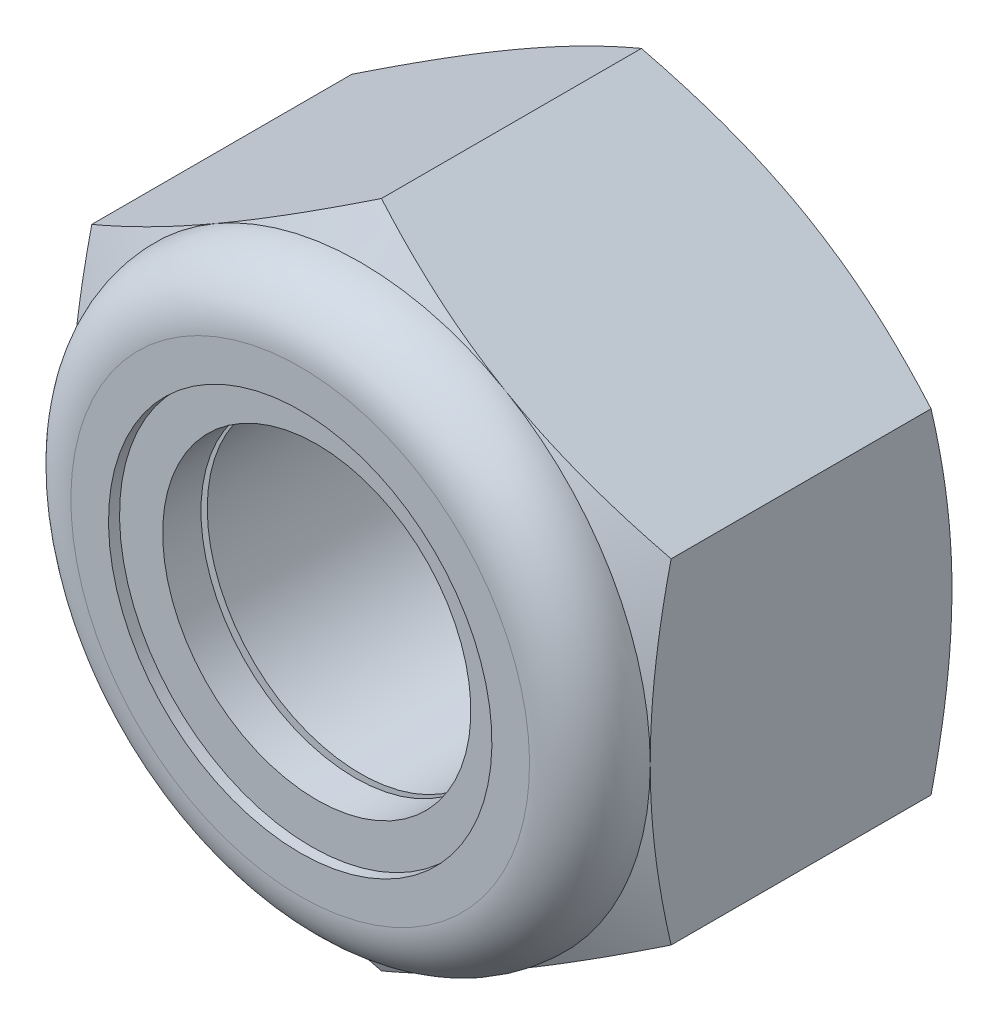
ISO-10303-21;
HEADER;
FILE_DESCRIPTION(('STEP AP214'),'2;1');
FILE_NAME('part.step','',(''),(''),'','','');
FILE_SCHEMA(('AUTOMOTIVE_DESIGN { 1 0 10303 214 1 1 1 1 }'));
ENDSEC;
DATA;
#1=APPLICATION_CONTEXT('core data for automotive mechanical design processes');
#2=APPLICATION_PROTOCOL_DEFINITION('international standard','automotive_design',2000,#1);
#3=PRODUCT_CONTEXT('',#1,'mechanical');
#4=PRODUCT('Part','Part','',(#3));
#5=PRODUCT_RELATED_PRODUCT_CATEGORY('part','',(#4));
#6=PRODUCT_DEFINITION_FORMATION('','',#4);
#7=PRODUCT_DEFINITION_CONTEXT('part definition',#1,'design');
#8=PRODUCT_DEFINITION('design','',#6,#7);
#9=PRODUCT_DEFINITION_SHAPE('','',#8);
#10=(LENGTH_UNIT() NAMED_UNIT(*) SI_UNIT(.MILLI.,.METRE.));
#11=(NAMED_UNIT(*) PLANE_ANGLE_UNIT() SI_UNIT($,.RADIAN.));
#12=(NAMED_UNIT(*) SI_UNIT($,.STERADIAN.) SOLID_ANGLE_UNIT());
#13=UNCERTAINTY_MEASURE_WITH_UNIT(LENGTH_MEASURE(1.E-05),#10,'distance_accuracy_value','');
#14=(GEOMETRIC_REPRESENTATION_CONTEXT(3) GLOBAL_UNCERTAINTY_ASSIGNED_CONTEXT((#13)) GLOBAL_UNIT_ASSIGNED_CONTEXT((#10,
#11,#12)) REPRESENTATION_CONTEXT('',''));
#15=CARTESIAN_POINT('',(0.,0.,0.));
#16=DIRECTION('',(0.,0.,1.));
#17=DIRECTION('',(1.,0.,0.));
#18=AXIS2_PLACEMENT_3D('',#15,#16,#17);
#19=CARTESIAN_POINT('',(0.,3.16666666666667,4.8476));
#20=DIRECTION('',(0.,0.,1.));
#21=DIRECTION('',(0.,-1.,0.));
#22=AXIS2_PLACEMENT_3D('',#19,#20,#21);
#23=PLANE('',#22);
#24=CARTESIAN_POINT('',(0.,0.,4.8476));
#25=DIRECTION('',(0.,0.,-1.));
#26=DIRECTION('',(0.,1.,0.));
#27=AXIS2_PLACEMENT_3D('',#24,#25,#26);
#28=CIRCLE('',#27,2.64719450303479);
#29=CARTESIAN_POINT('',(0.,-2.64719450303479,4.8476));
#30=VERTEX_POINT('',#29);
#31=EDGE_CURVE('P0_E404',#30,#30,#28,.T.);
#32=ORIENTED_EDGE('',*,*,#31,.F.);
#33=EDGE_LOOP('',(#32));
#34=FACE_BOUND('',#33,.T.);
#35=CARTESIAN_POINT('',(0.,0.,4.8476));
#36=DIRECTION('',(0.,0.,-1.));
#37=DIRECTION('',(0.,1.,0.));
#38=AXIS2_PLACEMENT_3D('',#35,#36,#37);
#39=CIRCLE('',#38,3.16666666666667);
#40=CARTESIAN_POINT('',(0.,-3.16666666666667,4.8476));
#41=VERTEX_POINT('',#40);
#42=EDGE_CURVE('P0_E451',#41,#41,#39,.T.);
#43=ORIENTED_EDGE('',*,*,#42,.T.);
#44=EDGE_LOOP('',(#43));
#45=FACE_BOUND('',#44,.T.);
#46=ADVANCED_FACE('P0_F17',(#34,#45),#23,.F.);
#47=CARTESIAN_POINT('',(0.,0.,4.16666666666667));
#48=DIRECTION('',(0.,0.,-1.));
#49=DIRECTION('',(-1.,0.,0.));
#50=AXIS2_PLACEMENT_3D('',#47,#48,#49);
#51=PLANE('',#50);
#52=CARTESIAN_POINT('',(0.,0.,4.16666666666667));
#53=DIRECTION('',(0.,0.,-1.));
#54=DIRECTION('',(-1.,0.,0.));
#55=AXIS2_PLACEMENT_3D('',#52,#53,#54);
#56=CIRCLE('',#55,2.117);
#57=CARTESIAN_POINT('',(2.117,0.,4.16666666666667));
#58=VERTEX_POINT('',#57);
#59=EDGE_CURVE('P0_E258',#58,#58,#56,.T.);
#60=ORIENTED_EDGE('',*,*,#59,.T.);
#61=EDGE_LOOP('',(#60));
#62=FACE_BOUND('',#61,.T.);
#63=CARTESIAN_POINT('',(0.,0.,4.16666666666667));
#64=DIRECTION('',(0.,0.,-1.));
#65=DIRECTION('',(0.,1.,0.));
#66=AXIS2_PLACEMENT_3D('',#63,#64,#65);
#67=CIRCLE('',#66,3.8476);
#68=CARTESIAN_POINT('',(0.,-3.8476,4.16666666666667));
#69=VERTEX_POINT('',#68);
#70=EDGE_CURVE('P0_E288',#69,#69,#67,.T.);
#71=ORIENTED_EDGE('',*,*,#70,.F.);
#72=EDGE_LOOP('',(#71));
#73=FACE_BOUND('',#72,.T.);
#74=ADVANCED_FACE('P0_F709',(#62,#73),#51,.F.);
#75=CARTESIAN_POINT('',(4.,2.3094010767585,5.));
#76=DIRECTION('',(-0.5,-0.866025403784439,0.));
#77=DIRECTION('',(-0.866025403784439,0.5,0.));
#78=AXIS2_PLACEMENT_3D('',#75,#76,#77);
#79=PLANE('',#78);
#80=DIRECTION('',(0.,0.,-1.));
#81=VECTOR('',#80,1.);
#82=CARTESIAN_POINT('',(0.,4.61880215351701,5.));
#83=LINE('',#82,#81);
#84=CARTESIAN_POINT('',(0.,4.61880215351701,3.87811448359888));
#85=VERTEX_POINT('',#84);
#86=CARTESIAN_POINT('',(0.,4.61880215351701,0.288552183067788));
#87=VERTEX_POINT('',#86);
#88=EDGE_CURVE('P0_E11',#85,#87,#83,.T.);
#89=ORIENTED_EDGE('',*,*,#88,.F.);
#90=CARTESIAN_POINT('',(-8.6979939773308E-12,4.61880215352203,3.87811448359654));
#91=CARTESIAN_POINT('',(1.071796769721,4.00000000000202,4.16666666666667));
#92=CARTESIAN_POINT('',(2.00000000000001,3.46410161513776,4.16666666666667));
#93=(BOUNDED_CURVE() B_SPLINE_CURVE(2,(#90,#91,#92),.UNSPECIFIED.,.F.,
.F.) B_SPLINE_CURVE_WITH_KNOTS((3,3),(1.00048260004605,1.54304701650115),
.UNSPECIFIED.) CURVE() GEOMETRIC_REPRESENTATION_ITEM() RATIONAL_B_SPLINE_CURVE((2.21375918402254,
2.38499405282908,2.38499405282908)) REPRESENTATION_ITEM(''));
#94=CARTESIAN_POINT('',(2.,3.46410161513776,4.16666666666667));
#95=VERTEX_POINT('',#94);
#96=EDGE_CURVE('P0_E289',#85,#95,#93,.T.);
#97=ORIENTED_EDGE('',*,*,#96,.T.);
#98=CARTESIAN_POINT('',(2.00000000000001,3.46410161513776,4.16666666666667));
#99=CARTESIAN_POINT('',(2.92820323027901,2.92820323027349,4.16666666666667));
#100=CARTESIAN_POINT('',(4.0000000000087,2.30940107675349,3.87811448359654));
#101=(BOUNDED_CURVE() B_SPLINE_CURVE(2,(#98,#99,#100),.UNSPECIFIED.,.F.,
.F.) B_SPLINE_CURVE_WITH_KNOTS((3,3),(1.54304701650115,2.08561143295624),
.UNSPECIFIED.) CURVE() GEOMETRIC_REPRESENTATION_ITEM() RATIONAL_B_SPLINE_CURVE((2.38499405282908,
2.38499405282908,2.21375918402255)) REPRESENTATION_ITEM(''));
#102=CARTESIAN_POINT('',(4.,2.30940107675851,3.87811448359888));
#103=VERTEX_POINT('',#102);
#104=EDGE_CURVE('P0_E348',#95,#103,#101,.T.);
#105=ORIENTED_EDGE('',*,*,#104,.T.);
#106=DIRECTION('',(0.,0.,-1.));
#107=VECTOR('',#106,1.);
#108=CARTESIAN_POINT('',(4.,2.3094010767585,5.));
#109=LINE('',#108,#107);
#110=CARTESIAN_POINT('',(4.,2.30940107675851,0.288552183067787));
#111=VERTEX_POINT('',#110);
#112=EDGE_CURVE('P0_E171',#103,#111,#109,.T.);
#113=ORIENTED_EDGE('',*,*,#112,.T.);
#114=CARTESIAN_POINT('',(4.0000000000087,2.30940107675349,0.288552183070129));
#115=CARTESIAN_POINT('',(2.928203230279,2.9282032302735,0.));
#116=CARTESIAN_POINT('',(2.,3.46410161513776,0.));
#117=(BOUNDED_CURVE() B_SPLINE_CURVE(2,(#114,#115,#116),.UNSPECIFIED.,.F.,
.F.) B_SPLINE_CURVE_WITH_KNOTS((3,3),(1.00048260004605,1.54304701650115),
.UNSPECIFIED.) CURVE() GEOMETRIC_REPRESENTATION_ITEM() RATIONAL_B_SPLINE_CURVE((2.21375918402254,
2.38499405282908,2.38499405282908)) REPRESENTATION_ITEM(''));
#118=CARTESIAN_POINT('',(2.,3.46410161513776,0.));
#119=VERTEX_POINT('',#118);
#120=EDGE_CURVE('P0_E331',#111,#119,#117,.T.);
#121=ORIENTED_EDGE('',*,*,#120,.T.);
#122=CARTESIAN_POINT('',(2.,3.46410161513776,0.));
#123=CARTESIAN_POINT('',(1.07179676972099,4.00000000000203,0.));
#124=CARTESIAN_POINT('',(-8.70240726793949E-12,4.61880215352204,0.288552183070132));
#125=(BOUNDED_CURVE() B_SPLINE_CURVE(2,(#122,#123,#124),.UNSPECIFIED.,.F.,
.F.) B_SPLINE_CURVE_WITH_KNOTS((3,3),(1.54304701650115,2.08561143295625),
.UNSPECIFIED.) CURVE() GEOMETRIC_REPRESENTATION_ITEM() RATIONAL_B_SPLINE_CURVE((2.38499405282908,
2.38499405282908,2.21375918402254)) REPRESENTATION_ITEM(''));
#126=EDGE_CURVE('P0_E309',#119,#87,#125,.T.);
#127=ORIENTED_EDGE('',*,*,#126,.T.);
#128=EDGE_LOOP('',(#89,#97,#105,#113,#121,#127));
#129=FACE_BOUND('',#128,.T.);
#130=ADVANCED_FACE('P0_F549',(#129),#79,.F.);
#131=CARTESIAN_POINT('',(0.,4.61880215351701,5.));
#132=DIRECTION('',(0.5,-0.866025403784439,0.));
#133=DIRECTION('',(0.,0.,-1.));
#134=AXIS2_PLACEMENT_3D('',#131,#132,#133);
#135=PLANE('',#134);
#136=DIRECTION('',(0.,0.,-1.));
#137=VECTOR('',#136,1.);
#138=CARTESIAN_POINT('',(-4.,2.3094010767585,5.));
#139=LINE('',#138,#137);
#140=CARTESIAN_POINT('',(-4.,2.3094010767585,3.87811448359888));
#141=VERTEX_POINT('',#140);
#142=CARTESIAN_POINT('',(-4.,2.30940107675851,0.288552183067787));
#143=VERTEX_POINT('',#142);
#144=EDGE_CURVE('P0_E28',#141,#143,#139,.T.);
#145=ORIENTED_EDGE('',*,*,#144,.F.);
#146=CARTESIAN_POINT('',(-4.0000000000087,2.30940107675348,3.87811448359654));
#147=CARTESIAN_POINT('',(-2.928203230279,2.92820323027349,4.16666666666667));
#148=CARTESIAN_POINT('',(-1.99999999999999,3.46410161513776,4.16666666666667));
#149=(BOUNDED_CURVE() B_SPLINE_CURVE(2,(#146,#147,#148),.UNSPECIFIED.,.F.,
.F.) B_SPLINE_CURVE_WITH_KNOTS((3,3),(1.00048260004605,1.54304701650115),
.UNSPECIFIED.) CURVE() GEOMETRIC_REPRESENTATION_ITEM() RATIONAL_B_SPLINE_CURVE((2.21375918402254,
2.38499405282908,2.38499405282908)) REPRESENTATION_ITEM(''));
#150=CARTESIAN_POINT('',(-2.,3.46410161513776,4.16666666666667));
#151=VERTEX_POINT('',#150);
#152=EDGE_CURVE('P0_E230',#141,#151,#149,.T.);
#153=ORIENTED_EDGE('',*,*,#152,.T.);
#154=CARTESIAN_POINT('',(-1.99999999999999,3.46410161513776,4.16666666666667));
#155=CARTESIAN_POINT('',(-1.07179676972099,4.00000000000202,4.16666666666667));
#156=CARTESIAN_POINT('',(8.69358068672214E-12,4.61880215352203,3.87811448359654));
#157=(BOUNDED_CURVE() B_SPLINE_CURVE(2,(#154,#155,#156),.UNSPECIFIED.,.F.,
.F.) B_SPLINE_CURVE_WITH_KNOTS((3,3),(1.54304701650115,2.08561143295625),
.UNSPECIFIED.) CURVE() GEOMETRIC_REPRESENTATION_ITEM() RATIONAL_B_SPLINE_CURVE((2.38499405282908,
2.38499405282908,2.21375918402255)) REPRESENTATION_ITEM(''));
#158=EDGE_CURVE('P0_E295',#151,#85,#157,.T.);
#159=ORIENTED_EDGE('',*,*,#158,.T.);
#160=ORIENTED_EDGE('',*,*,#88,.T.);
#161=CARTESIAN_POINT('',(8.70020062263516E-12,4.61880215352203,0.288552183070129));
#162=CARTESIAN_POINT('',(-1.071796769721,4.00000000000202,0.));
#163=CARTESIAN_POINT('',(-2.00000000000001,3.46410161513775,0.));
#164=(BOUNDED_CURVE() B_SPLINE_CURVE(2,(#161,#162,#163),.UNSPECIFIED.,.F.,
.F.) B_SPLINE_CURVE_WITH_KNOTS((3,3),(1.00048260004605,1.54304701650115),
.UNSPECIFIED.) CURVE() GEOMETRIC_REPRESENTATION_ITEM() RATIONAL_B_SPLINE_CURVE((2.21375918402254,
2.38499405282908,2.38499405282908)) REPRESENTATION_ITEM(''));
#165=CARTESIAN_POINT('',(-2.,3.46410161513776,0.));
#166=VERTEX_POINT('',#165);
#167=EDGE_CURVE('P0_E315',#87,#166,#164,.T.);
#168=ORIENTED_EDGE('',*,*,#167,.T.);
#169=CARTESIAN_POINT('',(-2.00000000000001,3.46410161513775,0.));
#170=CARTESIAN_POINT('',(-2.92820323027901,2.92820323027349,0.));
#171=CARTESIAN_POINT('',(-4.0000000000087,2.30940107675348,0.288552183070129));
#172=(BOUNDED_CURVE() B_SPLINE_CURVE(2,(#169,#170,#171),.UNSPECIFIED.,.F.,
.F.) B_SPLINE_CURVE_WITH_KNOTS((3,3),(1.54304701650115,2.08561143295625),
.UNSPECIFIED.) CURVE() GEOMETRIC_REPRESENTATION_ITEM() RATIONAL_B_SPLINE_CURVE((2.38499405282908,
2.38499405282908,2.21375918402254)) REPRESENTATION_ITEM(''));
#173=EDGE_CURVE('P0_E212',#166,#143,#172,.T.);
#174=ORIENTED_EDGE('',*,*,#173,.T.);
#175=EDGE_LOOP('',(#145,#153,#159,#160,#168,#174));
#176=FACE_BOUND('',#175,.T.);
#177=ADVANCED_FACE('P0_F546',(#176),#135,.F.);
#178=CARTESIAN_POINT('',(-4.,2.3094010767585,5.));
#179=DIRECTION('',(1.,0.,0.));
#180=DIRECTION('',(0.,1.,0.));
#181=AXIS2_PLACEMENT_3D('',#178,#179,#180);
#182=PLANE('',#181);
#183=DIRECTION('',(0.,0.,-1.));
#184=VECTOR('',#183,1.);
#185=CARTESIAN_POINT('',(-4.,-2.3094010767585,5.));
#186=LINE('',#185,#184);
#187=CARTESIAN_POINT('',(-4.,-2.3094010767585,3.87811448359888));
#188=VERTEX_POINT('',#187);
#189=CARTESIAN_POINT('',(-4.,-2.3094010767585,0.288552183067786));
#190=VERTEX_POINT('',#189);
#191=EDGE_CURVE('P0_E137',#188,#190,#186,.T.);
#192=ORIENTED_EDGE('',*,*,#191,.F.);
#193=CARTESIAN_POINT('',(-4.,-2.30940107676855,3.87811448359654));
#194=CARTESIAN_POINT('',(-4.,-1.07179676972853,4.16666666666667));
#195=CARTESIAN_POINT('',(-4.,0.,4.16666666666667));
#196=(BOUNDED_CURVE() B_SPLINE_CURVE(2,(#193,#194,#195),.UNSPECIFIED.,.F.,
.F.) B_SPLINE_CURVE_WITH_KNOTS((3,3),(1.00048260004605,1.54304701650115),
.UNSPECIFIED.) CURVE() GEOMETRIC_REPRESENTATION_ITEM() RATIONAL_B_SPLINE_CURVE((2.21375918402254,
2.38499405282908,2.38499405282908)) REPRESENTATION_ITEM(''));
#197=CARTESIAN_POINT('',(-4.,0.,4.16666666666667));
#198=VERTEX_POINT('',#197);
#199=EDGE_CURVE('P0_E235',#188,#198,#196,.T.);
#200=ORIENTED_EDGE('',*,*,#199,.T.);
#201=CARTESIAN_POINT('',(-4.,0.,4.16666666666667));
#202=CARTESIAN_POINT('',(-4.,1.07179676972853,4.16666666666667));
#203=CARTESIAN_POINT('',(-4.,2.30940107676855,3.87811448359654));
#204=(BOUNDED_CURVE() B_SPLINE_CURVE(2,(#201,#202,#203),.UNSPECIFIED.,.F.,
.F.) B_SPLINE_CURVE_WITH_KNOTS((3,3),(1.54304701650115,2.08561143295625),
.UNSPECIFIED.) CURVE() GEOMETRIC_REPRESENTATION_ITEM() RATIONAL_B_SPLINE_CURVE((2.38499405282908,
2.38499405282908,2.21375918402254)) REPRESENTATION_ITEM(''));
#205=EDGE_CURVE('P0_E182',#198,#141,#204,.T.);
#206=ORIENTED_EDGE('',*,*,#205,.T.);
#207=ORIENTED_EDGE('',*,*,#144,.T.);
#208=CARTESIAN_POINT('',(-4.,2.30940107676855,0.28855218307013));
#209=CARTESIAN_POINT('',(-4.,1.07179676972853,0.));
#210=CARTESIAN_POINT('',(-4.,0.,0.));
#211=(BOUNDED_CURVE() B_SPLINE_CURVE(2,(#208,#209,#210),.UNSPECIFIED.,.F.,
.F.) B_SPLINE_CURVE_WITH_KNOTS((3,3),(1.00048260004605,1.54304701650115),
.UNSPECIFIED.) CURVE() GEOMETRIC_REPRESENTATION_ITEM() RATIONAL_B_SPLINE_CURVE((2.21375918402254,
2.38499405282908,2.38499405282908)) REPRESENTATION_ITEM(''));
#212=CARTESIAN_POINT('',(-4.,0.,0.));
#213=VERTEX_POINT('',#212);
#214=EDGE_CURVE('P0_E220',#143,#213,#211,.T.);
#215=ORIENTED_EDGE('',*,*,#214,.T.);
#216=CARTESIAN_POINT('',(-4.,0.,0.));
#217=CARTESIAN_POINT('',(-4.,-1.07179676972853,0.));
#218=CARTESIAN_POINT('',(-4.,-2.30940107676854,0.288552183070126));
#219=(BOUNDED_CURVE() B_SPLINE_CURVE(2,(#216,#217,#218),.UNSPECIFIED.,.F.,
.F.) B_SPLINE_CURVE_WITH_KNOTS((3,3),(1.54304701650115,2.08561143295624),
.UNSPECIFIED.) CURVE() GEOMETRIC_REPRESENTATION_ITEM() RATIONAL_B_SPLINE_CURVE((2.38499405282908,
2.38499405282908,2.21375918402254)) REPRESENTATION_ITEM(''));
#220=EDGE_CURVE('P0_E271',#213,#190,#219,.T.);
#221=ORIENTED_EDGE('',*,*,#220,.T.);
#222=EDGE_LOOP('',(#192,#200,#206,#207,#215,#221));
#223=FACE_BOUND('',#222,.T.);
#224=ADVANCED_FACE('P0_F542',(#223),#182,.F.);
#225=CARTESIAN_POINT('',(-4.,-2.3094010767585,5.));
#226=DIRECTION('',(0.5,0.866025403784439,0.));
#227=DIRECTION('',(0.,0.,-1.));
#228=AXIS2_PLACEMENT_3D('',#225,#226,#227);
#229=PLANE('',#228);
#230=DIRECTION('',(0.,0.,-1.));
#231=VECTOR('',#230,1.);
#232=CARTESIAN_POINT('',(0.,-4.61880215351701,5.));
#233=LINE('',#232,#231);
#234=CARTESIAN_POINT('',(0.,-4.61880215351701,3.87811448359888));
#235=VERTEX_POINT('',#234);
#236=CARTESIAN_POINT('',(0.,-4.61880215351701,0.288552183067786));
#237=VERTEX_POINT('',#236);
#238=EDGE_CURVE('P0_E241',#235,#237,#233,.T.);
#239=ORIENTED_EDGE('',*,*,#238,.F.);
#240=CARTESIAN_POINT('',(8.70020062263514E-12,-4.61880215352203,3.87811448359654));
#241=CARTESIAN_POINT('',(-1.07179676972099,-4.00000000000202,4.16666666666666));
#242=CARTESIAN_POINT('',(-1.99999999999999,-3.46410161513776,4.16666666666667));
#243=(BOUNDED_CURVE() B_SPLINE_CURVE(2,(#240,#241,#242),.UNSPECIFIED.,.F.,
.F.) B_SPLINE_CURVE_WITH_KNOTS((3,3),(1.00048260004605,1.54304701650115),
.UNSPECIFIED.) CURVE() GEOMETRIC_REPRESENTATION_ITEM() RATIONAL_B_SPLINE_CURVE((2.21375918402255,
2.38499405282909,2.38499405282909)) REPRESENTATION_ITEM(''));
#244=CARTESIAN_POINT('',(-2.,-3.46410161513776,4.16666666666667));
#245=VERTEX_POINT('',#244);
#246=EDGE_CURVE('P0_E180',#235,#245,#243,.T.);
#247=ORIENTED_EDGE('',*,*,#246,.T.);
#248=CARTESIAN_POINT('',(-1.99999999999999,-3.46410161513776,4.16666666666667));
#249=CARTESIAN_POINT('',(-2.928203230279,-2.92820323027349,4.16666666666667));
#250=CARTESIAN_POINT('',(-4.00000000000871,-2.30940107675348,3.87811448359654));
#251=(BOUNDED_CURVE() B_SPLINE_CURVE(2,(#248,#249,#250),.UNSPECIFIED.,.F.,
.F.) B_SPLINE_CURVE_WITH_KNOTS((3,3),(1.54304701650115,2.08561143295625),
.UNSPECIFIED.) CURVE() GEOMETRIC_REPRESENTATION_ITEM() RATIONAL_B_SPLINE_CURVE((2.38499405282909,
2.38499405282909,2.21375918402255)) REPRESENTATION_ITEM(''));
#252=EDGE_CURVE('P0_E278',#245,#188,#251,.T.);
#253=ORIENTED_EDGE('',*,*,#252,.T.);
#254=ORIENTED_EDGE('',*,*,#191,.T.);
#255=CARTESIAN_POINT('',(-4.0000000000087,-2.30940107675348,0.288552183070128));
#256=CARTESIAN_POINT('',(-2.92820323027901,-2.92820323027349,0.));
#257=CARTESIAN_POINT('',(-2.,-3.46410161513775,0.));
#258=(BOUNDED_CURVE() B_SPLINE_CURVE(2,(#255,#256,#257),.UNSPECIFIED.,.F.,
.F.) B_SPLINE_CURVE_WITH_KNOTS((3,3),(1.00048260004605,1.54304701650115),
.UNSPECIFIED.) CURVE() GEOMETRIC_REPRESENTATION_ITEM() RATIONAL_B_SPLINE_CURVE((2.21375918402255,
2.38499405282909,2.38499405282909)) REPRESENTATION_ITEM(''));
#259=CARTESIAN_POINT('',(-2.,-3.46410161513776,0.));
#260=VERTEX_POINT('',#259);
#261=EDGE_CURVE('P0_E78',#190,#260,#258,.T.);
#262=ORIENTED_EDGE('',*,*,#261,.T.);
#263=CARTESIAN_POINT('',(-2.,-3.46410161513775,0.));
#264=CARTESIAN_POINT('',(-1.071796769721,-4.00000000000202,0.));
#265=CARTESIAN_POINT('',(8.69478431143359E-12,-4.61880215352203,0.288552183070127));
#266=(BOUNDED_CURVE() B_SPLINE_CURVE(2,(#263,#264,#265),.UNSPECIFIED.,.F.,
.F.) B_SPLINE_CURVE_WITH_KNOTS((3,3),(1.54304701650115,2.08561143295625),
.UNSPECIFIED.) CURVE() GEOMETRIC_REPRESENTATION_ITEM() RATIONAL_B_SPLINE_CURVE((2.38499405282909,
2.38499405282909,2.21375918402255)) REPRESENTATION_ITEM(''));
#267=EDGE_CURVE('P0_E393',#260,#237,#266,.T.);
#268=ORIENTED_EDGE('',*,*,#267,.T.);
#269=EDGE_LOOP('',(#239,#247,#253,#254,#262,#268));
#270=FACE_BOUND('',#269,.T.);
#271=ADVANCED_FACE('P0_F731',(#270),#229,.F.);
#272=CARTESIAN_POINT('',(0.,-4.61880215351701,5.));
#273=DIRECTION('',(-0.5,0.866025403784439,0.));
#274=DIRECTION('',(0.,0.,1.));
#275=AXIS2_PLACEMENT_3D('',#272,#273,#274);
#276=PLANE('',#275);
#277=DIRECTION('',(0.,0.,-1.));
#278=VECTOR('',#277,1.);
#279=CARTESIAN_POINT('',(4.,-2.30940107675851,5.));
#280=LINE('',#279,#278);
#281=CARTESIAN_POINT('',(4.,-2.30940107675851,3.87811448359888));
#282=VERTEX_POINT('',#281);
#283=CARTESIAN_POINT('',(4.,-2.30940107675851,0.288552183067786));
#284=VERTEX_POINT('',#283);
#285=EDGE_CURVE('P0_E42',#282,#284,#280,.T.);
#286=ORIENTED_EDGE('',*,*,#285,.F.);
#287=CARTESIAN_POINT('',(4.0000000000087,-2.30940107675348,3.87811448359654));
#288=CARTESIAN_POINT('',(2.928203230279,-2.92820323027349,4.16666666666667));
#289=CARTESIAN_POINT('',(1.99999999999999,-3.46410161513776,4.16666666666667));
#290=(BOUNDED_CURVE() B_SPLINE_CURVE(2,(#287,#288,#289),.UNSPECIFIED.,.F.,
.F.) B_SPLINE_CURVE_WITH_KNOTS((3,3),(1.00048260004605,1.54304701650115),
.UNSPECIFIED.) CURVE() GEOMETRIC_REPRESENTATION_ITEM() RATIONAL_B_SPLINE_CURVE((2.21375918402254,
2.38499405282908,2.38499405282908)) REPRESENTATION_ITEM(''));
#291=CARTESIAN_POINT('',(2.,-3.46410161513776,4.16666666666667));
#292=VERTEX_POINT('',#291);
#293=EDGE_CURVE('P0_E166',#282,#292,#290,.T.);
#294=ORIENTED_EDGE('',*,*,#293,.T.);
#295=CARTESIAN_POINT('',(1.99999999999999,-3.46410161513776,4.16666666666667));
#296=CARTESIAN_POINT('',(1.07179676972099,-4.00000000000202,4.16666666666666));
#297=CARTESIAN_POINT('',(-8.70200605970234E-12,-4.61880215352203,3.87811448359654));
#298=(BOUNDED_CURVE() B_SPLINE_CURVE(2,(#295,#296,#297),.UNSPECIFIED.,.F.,
.F.) B_SPLINE_CURVE_WITH_KNOTS((3,3),(1.54304701650115,2.08561143295625),
.UNSPECIFIED.) CURVE() GEOMETRIC_REPRESENTATION_ITEM() RATIONAL_B_SPLINE_CURVE((2.38499405282908,
2.38499405282908,2.21375918402254)) REPRESENTATION_ITEM(''));
#299=EDGE_CURVE('P0_E169',#292,#235,#298,.T.);
#300=ORIENTED_EDGE('',*,*,#299,.T.);
#301=ORIENTED_EDGE('',*,*,#238,.T.);
#302=CARTESIAN_POINT('',(-8.70822478737819E-12,-4.61880215352203,0.288552183070128));
#303=CARTESIAN_POINT('',(1.07179676972099,-4.00000000000202,0.));
#304=CARTESIAN_POINT('',(2.,-3.46410161513776,0.));
#305=(BOUNDED_CURVE() B_SPLINE_CURVE(2,(#302,#303,#304),.UNSPECIFIED.,.F.,
.F.) B_SPLINE_CURVE_WITH_KNOTS((3,3),(1.00048260004605,1.54304701650115),
.UNSPECIFIED.) CURVE() GEOMETRIC_REPRESENTATION_ITEM() RATIONAL_B_SPLINE_CURVE((2.21375918402254,
2.38499405282908,2.38499405282909)) REPRESENTATION_ITEM(''));
#306=CARTESIAN_POINT('',(2.,-3.46410161513776,0.));
#307=VERTEX_POINT('',#306);
#308=EDGE_CURVE('P0_E385',#237,#307,#305,.T.);
#309=ORIENTED_EDGE('',*,*,#308,.T.);
#310=CARTESIAN_POINT('',(2.,-3.46410161513776,0.));
#311=CARTESIAN_POINT('',(2.928203230279,-2.92820323027349,0.));
#312=CARTESIAN_POINT('',(4.0000000000087,-2.30940107675348,0.288552183070127));
#313=(BOUNDED_CURVE() B_SPLINE_CURVE(2,(#310,#311,#312),.UNSPECIFIED.,.F.,
.F.) B_SPLINE_CURVE_WITH_KNOTS((3,3),(1.54304701650115,2.08561143295625),
.UNSPECIFIED.) CURVE() GEOMETRIC_REPRESENTATION_ITEM() RATIONAL_B_SPLINE_CURVE((2.38499405282908,
2.38499405282908,2.21375918402254)) REPRESENTATION_ITEM(''));
#314=EDGE_CURVE('P0_E92',#307,#284,#313,.T.);
#315=ORIENTED_EDGE('',*,*,#314,.T.);
#316=EDGE_LOOP('',(#286,#294,#300,#301,#309,#315));
#317=FACE_BOUND('',#316,.T.);
#318=ADVANCED_FACE('P0_F168',(#317),#276,.F.);
#319=CARTESIAN_POINT('',(4.,-2.30940107675851,5.));
#320=DIRECTION('',(-1.,0.,0.));
#321=DIRECTION('',(0.,1.,0.));
#322=AXIS2_PLACEMENT_3D('',#319,#320,#321);
#323=PLANE('',#322);
#324=ORIENTED_EDGE('',*,*,#112,.F.);
#325=CARTESIAN_POINT('',(4.,2.30940107676855,3.87811448359654));
#326=CARTESIAN_POINT('',(4.,1.07179676972852,4.16666666666667));
#327=CARTESIAN_POINT('',(4.,0.,4.16666666666667));
#328=(BOUNDED_CURVE() B_SPLINE_CURVE(2,(#325,#326,#327),.UNSPECIFIED.,.F.,
.F.) B_SPLINE_CURVE_WITH_KNOTS((3,3),(1.00048260004605,1.54304701650115),
.UNSPECIFIED.) CURVE() GEOMETRIC_REPRESENTATION_ITEM() RATIONAL_B_SPLINE_CURVE((2.21375918402254,
2.38499405282908,2.38499405282908)) REPRESENTATION_ITEM(''));
#329=CARTESIAN_POINT('',(4.,0.,4.16666666666667));
#330=VERTEX_POINT('',#329);
#331=EDGE_CURVE('P0_E211',#103,#330,#328,.T.);
#332=ORIENTED_EDGE('',*,*,#331,.T.);
#333=CARTESIAN_POINT('',(4.,0.,4.16666666666667));
#334=CARTESIAN_POINT('',(4.,-1.07179676972854,4.16666666666666));
#335=CARTESIAN_POINT('',(4.,-2.30940107676855,3.87811448359654));
#336=(BOUNDED_CURVE() B_SPLINE_CURVE(2,(#333,#334,#335),.UNSPECIFIED.,.F.,
.F.) B_SPLINE_CURVE_WITH_KNOTS((3,3),(1.54304701650115,2.08561143295625),
.UNSPECIFIED.) CURVE() GEOMETRIC_REPRESENTATION_ITEM() RATIONAL_B_SPLINE_CURVE((2.38499405282908,
2.38499405282908,2.21375918402254)) REPRESENTATION_ITEM(''));
#337=EDGE_CURVE('P0_E161',#330,#282,#336,.T.);
#338=ORIENTED_EDGE('',*,*,#337,.T.);
#339=ORIENTED_EDGE('',*,*,#285,.T.);
#340=CARTESIAN_POINT('',(4.,-2.30940107676855,0.288552183070128));
#341=CARTESIAN_POINT('',(4.,-1.07179676972853,0.));
#342=CARTESIAN_POINT('',(4.,0.,0.));
#343=(BOUNDED_CURVE() B_SPLINE_CURVE(2,(#340,#341,#342),.UNSPECIFIED.,.F.,
.F.) B_SPLINE_CURVE_WITH_KNOTS((3,3),(1.00048260004605,1.54304701650115),
.UNSPECIFIED.) CURVE() GEOMETRIC_REPRESENTATION_ITEM() RATIONAL_B_SPLINE_CURVE((2.21375918402254,
2.38499405282908,2.38499405282908)) REPRESENTATION_ITEM(''));
#344=CARTESIAN_POINT('',(4.,0.,0.));
#345=VERTEX_POINT('',#344);
#346=EDGE_CURVE('P0_E263',#284,#345,#343,.T.);
#347=ORIENTED_EDGE('',*,*,#346,.T.);
#348=CARTESIAN_POINT('',(4.,0.,0.));
#349=CARTESIAN_POINT('',(4.,1.07179676972853,0.));
#350=CARTESIAN_POINT('',(4.,2.30940107676855,0.288552183070129));
#351=(BOUNDED_CURVE() B_SPLINE_CURVE(2,(#348,#349,#350),.UNSPECIFIED.,.F.,
.F.) B_SPLINE_CURVE_WITH_KNOTS((3,3),(1.54304701650115,2.08561143295625),
.UNSPECIFIED.) CURVE() GEOMETRIC_REPRESENTATION_ITEM() RATIONAL_B_SPLINE_CURVE((2.38499405282908,
2.38499405282908,2.21375918402254)) REPRESENTATION_ITEM(''));
#352=EDGE_CURVE('P0_E270',#345,#111,#351,.T.);
#353=ORIENTED_EDGE('',*,*,#352,.T.);
#354=EDGE_LOOP('',(#324,#332,#338,#339,#347,#353));
#355=FACE_BOUND('',#354,.T.);
#356=ADVANCED_FACE('P0_F467',(#355),#323,.F.);
#357=CARTESIAN_POINT('',(0.,0.,4.16666666666667));
#358=DIRECTION('',(0.,0.,-1.));
#359=DIRECTION('',(0.,1.,0.));
#360=AXIS2_PLACEMENT_3D('',#357,#358,#359);
#361=CONICAL_SURFACE('',#360,4.,1.13446401379631);
#362=ORIENTED_EDGE('',*,*,#337,.F.);
#363=CARTESIAN_POINT('',(0.,0.,4.16666666666667));
#364=DIRECTION('',(0.,0.,-1.));
#365=DIRECTION('',(0.,1.,0.));
#366=AXIS2_PLACEMENT_3D('',#363,#364,#365);
#367=CIRCLE('',#366,4.);
#368=EDGE_CURVE('P0_E184',#330,#292,#367,.T.);
#369=ORIENTED_EDGE('',*,*,#368,.T.);
#370=ORIENTED_EDGE('',*,*,#293,.F.);
#371=EDGE_LOOP('',(#362,#369,#370));
#372=FACE_BOUND('',#371,.T.);
#373=ADVANCED_FACE('P0_F185',(#372),#361,.T.);
#374=CARTESIAN_POINT('',(0.,0.,4.16666666666667));
#375=DIRECTION('',(0.,0.,-1.));
#376=DIRECTION('',(0.,1.,0.));
#377=AXIS2_PLACEMENT_3D('',#374,#375,#376);
#378=CONICAL_SURFACE('',#377,4.,1.13446401379631);
#379=CARTESIAN_POINT('',(0.,0.,4.16666666666667));
#380=DIRECTION('',(0.,0.,-1.));
#381=DIRECTION('',(0.,1.,0.));
#382=AXIS2_PLACEMENT_3D('',#379,#380,#381);
#383=CIRCLE('',#382,4.);
#384=EDGE_CURVE('P0_E189',#95,#330,#383,.T.);
#385=ORIENTED_EDGE('',*,*,#384,.T.);
#386=ORIENTED_EDGE('',*,*,#331,.F.);
#387=ORIENTED_EDGE('',*,*,#104,.F.);
#388=EDGE_LOOP('',(#385,#386,#387));
#389=FACE_BOUND('',#388,.T.);
#390=ADVANCED_FACE('P0_F19',(#389),#378,.T.);
#391=CARTESIAN_POINT('',(0.,0.,4.16666666666667));
#392=DIRECTION('',(0.,0.,-1.));
#393=DIRECTION('',(0.,-1.,0.));
#394=AXIS2_PLACEMENT_3D('',#391,#392,#393);
#395=CONICAL_SURFACE('',#394,4.,1.13446401379631);
#396=ORIENTED_EDGE('',*,*,#299,.F.);
#397=CARTESIAN_POINT('',(0.,0.,4.16666666666667));
#398=DIRECTION('',(0.,0.,-1.));
#399=DIRECTION('',(0.,1.,0.));
#400=AXIS2_PLACEMENT_3D('',#397,#398,#399);
#401=CIRCLE('',#400,4.);
#402=CARTESIAN_POINT('',(0.,-4.,4.16666666666667));
#403=VERTEX_POINT('',#402);
#404=EDGE_CURVE('P0_E178',#292,#403,#401,.T.);
#405=ORIENTED_EDGE('',*,*,#404,.T.);
#406=CARTESIAN_POINT('',(0.,0.,4.16666666666667));
#407=DIRECTION('',(0.,0.,-1.));
#408=DIRECTION('',(0.,1.,0.));
#409=AXIS2_PLACEMENT_3D('',#406,#407,#408);
#410=CIRCLE('',#409,4.);
#411=EDGE_CURVE('P0_E343',#403,#245,#410,.T.);
#412=ORIENTED_EDGE('',*,*,#411,.T.);
#413=ORIENTED_EDGE('',*,*,#246,.F.);
#414=EDGE_LOOP('',(#396,#405,#412,#413));
#415=FACE_BOUND('',#414,.T.);
#416=ADVANCED_FACE('P0_F175',(#415),#395,.T.);
#417=CARTESIAN_POINT('',(0.,0.,4.16666666666667));
#418=DIRECTION('',(0.,0.,-1.));
#419=DIRECTION('',(0.,1.,0.));
#420=AXIS2_PLACEMENT_3D('',#417,#418,#419);
#421=CONICAL_SURFACE('',#420,4.,1.13446401379631);
#422=CARTESIAN_POINT('',(0.,0.,4.16666666666667));
#423=DIRECTION('',(0.,0.,-1.));
#424=DIRECTION('',(0.,1.,0.));
#425=AXIS2_PLACEMENT_3D('',#422,#423,#424);
#426=CIRCLE('',#425,4.);
#427=EDGE_CURVE('P0_E287',#198,#151,#426,.T.);
#428=ORIENTED_EDGE('',*,*,#427,.T.);
#429=ORIENTED_EDGE('',*,*,#152,.F.);
#430=ORIENTED_EDGE('',*,*,#205,.F.);
#431=EDGE_LOOP('',(#428,#429,#430));
#432=FACE_BOUND('',#431,.T.);
#433=ADVANCED_FACE('P0_F560',(#432),#421,.T.);
#434=CARTESIAN_POINT('',(0.,0.,4.16666666666667));
#435=DIRECTION('',(0.,0.,-1.));
#436=DIRECTION('',(0.,1.,0.));
#437=AXIS2_PLACEMENT_3D('',#434,#435,#436);
#438=CONICAL_SURFACE('',#437,4.,1.13446401379631);
#439=ORIENTED_EDGE('',*,*,#252,.F.);
#440=CARTESIAN_POINT('',(0.,0.,4.16666666666667));
#441=DIRECTION('',(0.,0.,-1.));
#442=DIRECTION('',(0.,1.,0.));
#443=AXIS2_PLACEMENT_3D('',#440,#441,#442);
#444=CIRCLE('',#443,4.);
#445=EDGE_CURVE('P0_E414',#245,#198,#444,.T.);
#446=ORIENTED_EDGE('',*,*,#445,.T.);
#447=ORIENTED_EDGE('',*,*,#199,.F.);
#448=EDGE_LOOP('',(#439,#446,#447));
#449=FACE_BOUND('',#448,.T.);
#450=ADVANCED_FACE('P0_F564',(#449),#438,.T.);
#451=CARTESIAN_POINT('',(0.,0.,0.288552183067787));
#452=DIRECTION('',(0.,0.,1.));
#453=DIRECTION('',(0.,-1.,0.));
#454=AXIS2_PLACEMENT_3D('',#451,#452,#453);
#455=CONICAL_SURFACE('',#454,4.61880215351701,1.13446401379631);
#456=CARTESIAN_POINT('',(0.,0.,0.));
#457=DIRECTION('',(0.,0.,-1.));
#458=DIRECTION('',(0.,1.,0.));
#459=AXIS2_PLACEMENT_3D('',#456,#457,#458);
#460=CIRCLE('',#459,4.);
#461=EDGE_CURVE('P0_E245',#260,#213,#460,.T.);
#462=ORIENTED_EDGE('',*,*,#461,.F.);
#463=ORIENTED_EDGE('',*,*,#261,.F.);
#464=ORIENTED_EDGE('',*,*,#220,.F.);
#465=EDGE_LOOP('',(#462,#463,#464));
#466=FACE_BOUND('',#465,.T.);
#467=ADVANCED_FACE('P0_F538',(#466),#455,.T.);
#468=CARTESIAN_POINT('',(0.,0.,0.288552183067787));
#469=DIRECTION('',(0.,0.,1.));
#470=DIRECTION('',(0.,-1.,0.));
#471=AXIS2_PLACEMENT_3D('',#468,#469,#470);
#472=CONICAL_SURFACE('',#471,4.61880215351701,1.13446401379631);
#473=CARTESIAN_POINT('',(0.,0.,0.));
#474=DIRECTION('',(0.,0.,-1.));
#475=DIRECTION('',(0.,1.,0.));
#476=AXIS2_PLACEMENT_3D('',#473,#474,#475);
#477=CIRCLE('',#476,4.);
#478=EDGE_CURVE('P0_E242',#213,#166,#477,.T.);
#479=ORIENTED_EDGE('',*,*,#478,.F.);
#480=ORIENTED_EDGE('',*,*,#214,.F.);
#481=ORIENTED_EDGE('',*,*,#173,.F.);
#482=EDGE_LOOP('',(#479,#480,#481));
#483=FACE_BOUND('',#482,.T.);
#484=ADVANCED_FACE('P0_F544',(#483),#472,.T.);
#485=CARTESIAN_POINT('',(0.,0.,0.288552183067787));
#486=DIRECTION('',(0.,0.,1.));
#487=DIRECTION('',(0.,1.,0.));
#488=AXIS2_PLACEMENT_3D('',#485,#486,#487);
#489=CONICAL_SURFACE('',#488,4.61880215351701,1.13446401379631);
#490=CARTESIAN_POINT('',(0.,0.,0.));
#491=DIRECTION('',(0.,0.,-1.));
#492=DIRECTION('',(0.,1.,0.));
#493=AXIS2_PLACEMENT_3D('',#490,#491,#492);
#494=CIRCLE('',#493,4.);
#495=EDGE_CURVE('P0_E229',#166,#119,#494,.T.);
#496=ORIENTED_EDGE('',*,*,#495,.F.);
#497=ORIENTED_EDGE('',*,*,#167,.F.);
#498=ORIENTED_EDGE('',*,*,#126,.F.);
#499=EDGE_LOOP('',(#496,#497,#498));
#500=FACE_BOUND('',#499,.T.);
#501=ADVANCED_FACE('P0_F548',(#500),#489,.T.);
#502=CARTESIAN_POINT('',(0.,0.,0.288552183067787));
#503=DIRECTION('',(0.,0.,1.));
#504=DIRECTION('',(0.,-1.,0.));
#505=AXIS2_PLACEMENT_3D('',#502,#503,#504);
#506=CONICAL_SURFACE('',#505,4.61880215351701,1.13446401379631);
#507=ORIENTED_EDGE('',*,*,#352,.F.);
#508=CARTESIAN_POINT('',(0.,0.,0.));
#509=DIRECTION('',(0.,0.,-1.));
#510=DIRECTION('',(0.,1.,0.));
#511=AXIS2_PLACEMENT_3D('',#508,#509,#510);
#512=CIRCLE('',#511,4.);
#513=EDGE_CURVE('P0_E221',#119,#345,#512,.T.);
#514=ORIENTED_EDGE('',*,*,#513,.F.);
#515=ORIENTED_EDGE('',*,*,#120,.F.);
#516=EDGE_LOOP('',(#507,#514,#515));
#517=FACE_BOUND('',#516,.T.);
#518=ADVANCED_FACE('P0_F477',(#517),#506,.T.);
#519=CARTESIAN_POINT('',(0.,0.,0.288552183067787));
#520=DIRECTION('',(0.,0.,1.));
#521=DIRECTION('',(0.,-1.,0.));
#522=AXIS2_PLACEMENT_3D('',#519,#520,#521);
#523=CONICAL_SURFACE('',#522,4.61880215351701,1.13446401379631);
#524=CARTESIAN_POINT('',(0.,0.,0.));
#525=DIRECTION('',(0.,0.,-1.));
#526=DIRECTION('',(0.,1.,0.));
#527=AXIS2_PLACEMENT_3D('',#524,#525,#526);
#528=CIRCLE('',#527,4.);
#529=EDGE_CURVE('P0_E228',#345,#307,#528,.T.);
#530=ORIENTED_EDGE('',*,*,#529,.F.);
#531=ORIENTED_EDGE('',*,*,#346,.F.);
#532=ORIENTED_EDGE('',*,*,#314,.F.);
#533=EDGE_LOOP('',(#530,#531,#532));
#534=FACE_BOUND('',#533,.T.);
#535=ADVANCED_FACE('P0_F471',(#534),#523,.T.);
#536=CARTESIAN_POINT('',(0.,4.61880215351701,0.));
#537=DIRECTION('',(0.,0.,1.));
#538=DIRECTION('',(0.,-1.,0.));
#539=AXIS2_PLACEMENT_3D('',#536,#537,#538);
#540=PLANE('',#539);
#541=CARTESIAN_POINT('',(0.,0.,0.));
#542=DIRECTION('',(0.,0.,-1.));
#543=DIRECTION('',(0.,1.,0.));
#544=AXIS2_PLACEMENT_3D('',#541,#542,#543);
#545=CIRCLE('',#544,2.5);
#546=CARTESIAN_POINT('',(0.,-2.5,0.));
#547=VERTEX_POINT('',#546);
#548=EDGE_CURVE('P0_E252',#547,#547,#545,.T.);
#549=ORIENTED_EDGE('',*,*,#548,.F.);
#550=EDGE_LOOP('',(#549));
#551=FACE_BOUND('',#550,.T.);
#552=CARTESIAN_POINT('',(0.,0.,0.));
#553=DIRECTION('',(0.,0.,-1.));
#554=DIRECTION('',(0.,1.,0.));
#555=AXIS2_PLACEMENT_3D('',#552,#553,#554);
#556=CIRCLE('',#555,4.);
#557=EDGE_CURVE('P0_E21',#307,#260,#556,.T.);
#558=ORIENTED_EDGE('',*,*,#557,.T.);
#559=ORIENTED_EDGE('',*,*,#461,.T.);
#560=ORIENTED_EDGE('',*,*,#478,.T.);
#561=ORIENTED_EDGE('',*,*,#495,.T.);
#562=ORIENTED_EDGE('',*,*,#513,.T.);
#563=ORIENTED_EDGE('',*,*,#529,.T.);
#564=EDGE_LOOP('',(#558,#559,#560,#561,#562,#563));
#565=FACE_BOUND('',#564,.T.);
#566=ADVANCED_FACE('P0_F473',(#551,#565),#540,.F.);
#567=CARTESIAN_POINT('',(0.,4.61880215351701,5.));
#568=DIRECTION('',(0.,0.,1.));
#569=DIRECTION('',(0.,-1.,0.));
#570=AXIS2_PLACEMENT_3D('',#567,#568,#569);
#571=PLANE('',#570);
#572=CARTESIAN_POINT('',(0.,0.,5.));
#573=DIRECTION('',(0.,0.,1.));
#574=DIRECTION('',(0.,-1.,0.));
#575=AXIS2_PLACEMENT_3D('',#572,#573,#574);
#576=CIRCLE('',#575,2.64719450303479);
#577=CARTESIAN_POINT('',(0.,-2.64719450303479,5.));
#578=VERTEX_POINT('',#577);
#579=EDGE_CURVE('P0_E247',#578,#578,#576,.T.);
#580=ORIENTED_EDGE('',*,*,#579,.F.);
#581=EDGE_LOOP('',(#580));
#582=FACE_BOUND('',#581,.T.);
#583=CARTESIAN_POINT('',(0.,0.,5.));
#584=DIRECTION('',(0.,0.,-1.));
#585=DIRECTION('',(0.,1.,0.));
#586=AXIS2_PLACEMENT_3D('',#583,#584,#585);
#587=CIRCLE('',#586,3.16666666666667);
#588=CARTESIAN_POINT('',(0.,-3.16666666666667,5.));
#589=VERTEX_POINT('',#588);
#590=EDGE_CURVE('P0_E197',#589,#589,#587,.T.);
#591=ORIENTED_EDGE('',*,*,#590,.F.);
#592=EDGE_LOOP('',(#591));
#593=FACE_BOUND('',#592,.T.);
#594=ADVANCED_FACE('P0_F744',(#582,#593),#571,.T.);
#595=CARTESIAN_POINT('',(0.,0.,0.288552183067787));
#596=DIRECTION('',(0.,0.,1.));
#597=DIRECTION('',(0.,-1.,0.));
#598=AXIS2_PLACEMENT_3D('',#595,#596,#597);
#599=CONICAL_SURFACE('',#598,4.61880215351701,1.13446401379631);
#600=ORIENTED_EDGE('',*,*,#557,.F.);
#601=ORIENTED_EDGE('',*,*,#308,.F.);
#602=ORIENTED_EDGE('',*,*,#267,.F.);
#603=EDGE_LOOP('',(#600,#601,#602));
#604=FACE_BOUND('',#603,.T.);
#605=ADVANCED_FACE('P0_F754',(#604),#599,.T.);
#606=CARTESIAN_POINT('',(0.,0.,4.16666666666667));
#607=DIRECTION('',(0.,0.,-1.));
#608=DIRECTION('',(0.,1.,0.));
#609=AXIS2_PLACEMENT_3D('',#606,#607,#608);
#610=CONICAL_SURFACE('',#609,4.,1.13446401379631);
#611=CARTESIAN_POINT('',(0.,0.,4.16666666666667));
#612=DIRECTION('',(0.,0.,-1.));
#613=DIRECTION('',(0.,1.,0.));
#614=AXIS2_PLACEMENT_3D('',#611,#612,#613);
#615=CIRCLE('',#614,4.);
#616=EDGE_CURVE('P0_E283',#151,#95,#615,.T.);
#617=ORIENTED_EDGE('',*,*,#616,.T.);
#618=ORIENTED_EDGE('',*,*,#96,.F.);
#619=ORIENTED_EDGE('',*,*,#158,.F.);
#620=EDGE_LOOP('',(#617,#618,#619));
#621=FACE_BOUND('',#620,.T.);
#622=ADVANCED_FACE('P0_F557',(#621),#610,.T.);
#623=CARTESIAN_POINT('',(0.,0.,4.16666666666667));
#624=DIRECTION('',(0.,0.,-1.));
#625=DIRECTION('',(0.,1.,0.));
#626=AXIS2_PLACEMENT_3D('',#623,#624,#625);
#627=TOROIDAL_SURFACE('',#626,3.16666666666667,0.833333333333334);
#628=ORIENTED_EDGE('',*,*,#616,.F.);
#629=ORIENTED_EDGE('',*,*,#427,.F.);
#630=ORIENTED_EDGE('',*,*,#445,.F.);
#631=ORIENTED_EDGE('',*,*,#411,.F.);
#632=CARTESIAN_POINT('',(0.,-3.16666666666667,4.16666666666667));
#633=DIRECTION('',(-1.,0.,0.));
#634=DIRECTION('',(0.,-1.,0.));
#635=AXIS2_PLACEMENT_3D('',#632,#633,#634);
#636=CIRCLE('',#635,0.833333333333334);
#637=EDGE_CURVE('P0_E194',#403,#589,#636,.T.);
#638=ORIENTED_EDGE('',*,*,#637,.T.);
#639=ORIENTED_EDGE('',*,*,#590,.T.);
#640=ORIENTED_EDGE('',*,*,#637,.F.);
#641=ORIENTED_EDGE('',*,*,#404,.F.);
#642=ORIENTED_EDGE('',*,*,#368,.F.);
#643=ORIENTED_EDGE('',*,*,#384,.F.);
#644=EDGE_LOOP('',(#628,#629,#630,#631,#638,#639,#640,#641,#642,#643));
#645=FACE_BOUND('',#644,.T.);
#646=ADVANCED_FACE('P0_F192',(#645),#627,.T.);
#647=CARTESIAN_POINT('',(0.,0.,4.16666666666667));
#648=DIRECTION('',(0.,0.,-1.));
#649=DIRECTION('',(0.,1.,0.));
#650=AXIS2_PLACEMENT_3D('',#647,#648,#649);
#651=TOROIDAL_SURFACE('',#650,3.16666666666667,0.680933333333333);
#652=ORIENTED_EDGE('',*,*,#42,.F.);
#653=CARTESIAN_POINT('',(0.,-3.16666666666667,4.16666666666667));
#654=DIRECTION('',(1.,0.,0.));
#655=DIRECTION('',(0.,-1.,0.));
#656=AXIS2_PLACEMENT_3D('',#653,#654,#655);
#657=CIRCLE('',#656,0.680933333333333);
#658=EDGE_CURVE('P0_E338',#41,#69,#657,.T.);
#659=ORIENTED_EDGE('',*,*,#658,.T.);
#660=ORIENTED_EDGE('',*,*,#70,.T.);
#661=ORIENTED_EDGE('',*,*,#658,.F.);
#662=EDGE_LOOP('',(#652,#659,#660,#661));
#663=FACE_BOUND('',#662,.T.);
#664=ADVANCED_FACE('P0_F713',(#663),#651,.F.);
#665=CARTESIAN_POINT('',(0.,0.,6.27));
#666=DIRECTION('',(0.,0.,-1.));
#667=DIRECTION('',(0.,1.,0.));
#668=AXIS2_PLACEMENT_3D('',#665,#666,#667);
#669=CYLINDRICAL_SURFACE('',#668,2.64719450303479);
#670=ORIENTED_EDGE('',*,*,#579,.T.);
#671=DIRECTION('',(0.,0.,-1.));
#672=VECTOR('',#671,1.);
#673=CARTESIAN_POINT('',(0.,-2.64719450303479,6.27));
#674=LINE('',#673,#672);
#675=EDGE_CURVE('P0_E251',#578,#30,#674,.T.);
#676=ORIENTED_EDGE('',*,*,#675,.T.);
#677=ORIENTED_EDGE('',*,*,#31,.T.);
#678=ORIENTED_EDGE('',*,*,#675,.F.);
#679=EDGE_LOOP('',(#670,#676,#677,#678));
#680=FACE_BOUND('',#679,.T.);
#681=ADVANCED_FACE('P0_F705',(#680),#669,.F.);
#682=CARTESIAN_POINT('',(0.,0.,0.));
#683=DIRECTION('',(0.,0.,-1.));
#684=DIRECTION('',(0.,1.,0.));
#685=AXIS2_PLACEMENT_3D('',#682,#683,#684);
#686=CONICAL_SURFACE('',#685,2.5,1.13446401379632);
#687=CARTESIAN_POINT('',(0.,0.,0.178595833073364));
#688=DIRECTION('',(0.,0.,1.));
#689=DIRECTION('',(-1.,0.,0.));
#690=AXIS2_PLACEMENT_3D('',#687,#688,#689);
#691=CIRCLE('',#690,2.117);
#692=CARTESIAN_POINT('',(2.117,0.,0.178595833073364));
#693=VERTEX_POINT('',#692);
#694=CARTESIAN_POINT('',(0.,-2.117,0.178595833073364));
#695=VERTEX_POINT('',#694);
#696=EDGE_CURVE('P0_E303',#693,#695,#691,.T.);
#697=ORIENTED_EDGE('',*,*,#696,.T.);
#698=DIRECTION('',(0.,-0.906307787036651,-0.422618261740698));
#699=VECTOR('',#698,1.);
#700=CARTESIAN_POINT('',(0.,-2.5,0.));
#701=LINE('',#700,#699);
#702=EDGE_CURVE('P0_E257',#695,#547,#701,.T.);
#703=ORIENTED_EDGE('',*,*,#702,.T.);
#704=ORIENTED_EDGE('',*,*,#548,.T.);
#705=ORIENTED_EDGE('',*,*,#702,.F.);
#706=CARTESIAN_POINT('',(0.,0.,0.178595833073364));
#707=DIRECTION('',(0.,0.,1.));
#708=DIRECTION('',(-1.,0.,0.));
#709=AXIS2_PLACEMENT_3D('',#706,#707,#708);
#710=CIRCLE('',#709,2.117);
#711=EDGE_CURVE('P0_E253',#695,#693,#710,.T.);
#712=ORIENTED_EDGE('',*,*,#711,.T.);
#713=EDGE_LOOP('',(#697,#703,#704,#705,#712));
#714=FACE_BOUND('',#713,.T.);
#715=ADVANCED_FACE('P0_F505',(#714),#686,.F.);
#716=CARTESIAN_POINT('',(0.,0.,2.75));
#717=DIRECTION('',(0.,0.,1.));
#718=DIRECTION('',(-1.,0.,0.));
#719=AXIS2_PLACEMENT_3D('',#716,#717,#718);
#720=CYLINDRICAL_SURFACE('',#719,2.117);
#721=ORIENTED_EDGE('',*,*,#696,.F.);
#722=DIRECTION('',(0.,0.,1.));
#723=VECTOR('',#722,1.);
#724=CARTESIAN_POINT('',(2.117,0.,2.75));
#725=LINE('',#724,#723);
#726=EDGE_CURVE('P0_E296',#693,#58,#725,.T.);
#727=ORIENTED_EDGE('',*,*,#726,.T.);
#728=ORIENTED_EDGE('',*,*,#59,.F.);
#729=ORIENTED_EDGE('',*,*,#726,.F.);
#730=ORIENTED_EDGE('',*,*,#711,.F.);
#731=EDGE_LOOP('',(#721,#727,#728,#729,#730));
#732=FACE_BOUND('',#731,.T.);
#733=ADVANCED_FACE('P0_F514',(#732),#720,.F.);
#734=CLOSED_SHELL('',(#46,#74,#130,#177,#224,#271,#318,#356,#373,#390,#416,#433,#450,#467,#484,
#501,#518,#535,#566,#594,#605,#622,#646,#664,#681,#715,#733));
#735=MANIFOLD_SOLID_BREP('P0_B1',#734);
#736=CARTESIAN_POINT('',(0.,3.16666666666667,4.7714));
#737=DIRECTION('',(0.,0.,1.));
#738=DIRECTION('',(0.,-1.,0.));
#739=AXIS2_PLACEMENT_3D('',#736,#737,#738);
#740=PLANE('',#739);
#741=CARTESIAN_POINT('',(0.,0.,4.7714));
#742=DIRECTION('',(0.,0.,-1.));
#743=DIRECTION('',(0.,1.,0.));
#744=AXIS2_PLACEMENT_3D('',#741,#742,#743);
#745=CIRCLE('',#744,2.12772233940292);
#746=CARTESIAN_POINT('',(0.,-2.12772233940292,4.7714));
#747=VERTEX_POINT('',#746);
#748=EDGE_CURVE('P1_E21',#747,#747,#745,.T.);
#749=ORIENTED_EDGE('',*,*,#748,.T.);
#750=EDGE_LOOP('',(#749));
#751=FACE_BOUND('',#750,.T.);
#752=CARTESIAN_POINT('',(0.,0.,4.7714));
#753=DIRECTION('',(0.,0.,-1.));
#754=DIRECTION('',(0.,1.,0.));
#755=AXIS2_PLACEMENT_3D('',#752,#753,#754);
#756=CIRCLE('',#755,3.16666666666667);
#757=CARTESIAN_POINT('',(0.,-3.16666666666667,4.7714));
#758=VERTEX_POINT('',#757);
#759=EDGE_CURVE('P1_E60',#758,#758,#756,.T.);
#760=ORIENTED_EDGE('',*,*,#759,.F.);
#761=EDGE_LOOP('',(#760));
#762=FACE_BOUND('',#761,.T.);
#763=ADVANCED_FACE('P1_F17',(#751,#762),#740,.T.);
#764=CARTESIAN_POINT('',(0.,2.12772233940292,4.24286666666667));
#765=DIRECTION('',(0.,0.,-1.));
#766=DIRECTION('',(-1.,0.,0.));
#767=AXIS2_PLACEMENT_3D('',#764,#765,#766);
#768=PLANE('',#767);
#769=CARTESIAN_POINT('',(0.,0.,4.24286666666667));
#770=DIRECTION('',(0.,0.,-1.));
#771=DIRECTION('',(0.,1.,0.));
#772=AXIS2_PLACEMENT_3D('',#769,#770,#771);
#773=CIRCLE('',#772,2.12772233940292);
#774=CARTESIAN_POINT('',(0.,-2.12772233940292,4.24286666666667));
#775=VERTEX_POINT('',#774);
#776=EDGE_CURVE('P1_E11',#775,#775,#773,.T.);
#777=ORIENTED_EDGE('',*,*,#776,.F.);
#778=EDGE_LOOP('',(#777));
#779=FACE_BOUND('',#778,.T.);
#780=CARTESIAN_POINT('',(0.,0.,4.24286666666667));
#781=DIRECTION('',(0.,0.,-1.));
#782=DIRECTION('',(0.,1.,0.));
#783=AXIS2_PLACEMENT_3D('',#780,#781,#782);
#784=CIRCLE('',#783,3.76657996410593);
#785=CARTESIAN_POINT('',(0.,-3.76657996410593,4.24286666666667));
#786=VERTEX_POINT('',#785);
#787=EDGE_CURVE('P1_E58',#786,#786,#784,.T.);
#788=ORIENTED_EDGE('',*,*,#787,.T.);
#789=EDGE_LOOP('',(#788));
#790=FACE_BOUND('',#789,.T.);
#791=ADVANCED_FACE('P1_F19',(#779,#790),#768,.T.);
#792=CARTESIAN_POINT('',(0.,0.,4.24286666666667));
#793=DIRECTION('',(0.,0.,-1.));
#794=DIRECTION('',(0.,1.,0.));
#795=AXIS2_PLACEMENT_3D('',#792,#793,#794);
#796=CYLINDRICAL_SURFACE('',#795,2.12772233940292);
#797=ORIENTED_EDGE('',*,*,#748,.F.);
#798=DIRECTION('',(0.,0.,-1.));
#799=VECTOR('',#798,1.);
#800=CARTESIAN_POINT('',(0.,-2.12772233940292,4.24286666666667));
#801=LINE('',#800,#799);
#802=EDGE_CURVE('P1_E27',#747,#775,#801,.T.);
#803=ORIENTED_EDGE('',*,*,#802,.T.);
#804=ORIENTED_EDGE('',*,*,#776,.T.);
#805=ORIENTED_EDGE('',*,*,#802,.F.);
#806=EDGE_LOOP('',(#797,#803,#804,#805));
#807=FACE_BOUND('',#806,.T.);
#808=ADVANCED_FACE('P1_F80',(#807),#796,.F.);
#809=CARTESIAN_POINT('',(0.,0.,4.16666666666667));
#810=DIRECTION('',(0.,0.,-1.));
#811=DIRECTION('',(0.,1.,0.));
#812=AXIS2_PLACEMENT_3D('',#809,#810,#811);
#813=TOROIDAL_SURFACE('',#812,3.16666666666667,0.604733333333333);
#814=ORIENTED_EDGE('',*,*,#787,.F.);
#815=CARTESIAN_POINT('',(0.,-3.16666666666667,4.16666666666667));
#816=DIRECTION('',(-1.,0.,0.));
#817=DIRECTION('',(0.,-1.,0.));
#818=AXIS2_PLACEMENT_3D('',#815,#816,#817);
#819=CIRCLE('',#818,0.604733333333333);
#820=EDGE_CURVE('P1_E55',#786,#758,#819,.T.);
#821=ORIENTED_EDGE('',*,*,#820,.T.);
#822=ORIENTED_EDGE('',*,*,#759,.T.);
#823=ORIENTED_EDGE('',*,*,#820,.F.);
#824=EDGE_LOOP('',(#814,#821,#822,#823));
#825=FACE_BOUND('',#824,.T.);
#826=ADVANCED_FACE('P1_F57',(#825),#813,.T.);
#827=CLOSED_SHELL('',(#763,#791,#808,#826));
#828=MANIFOLD_SOLID_BREP('P1_B1',#827);
#829=ADVANCED_BREP_SHAPE_REPRESENTATION('',(#18,#735,#828),#14);
#830=SHAPE_DEFINITION_REPRESENTATION(#9,#829);
ENDSEC;
END-ISO-10303-21;
